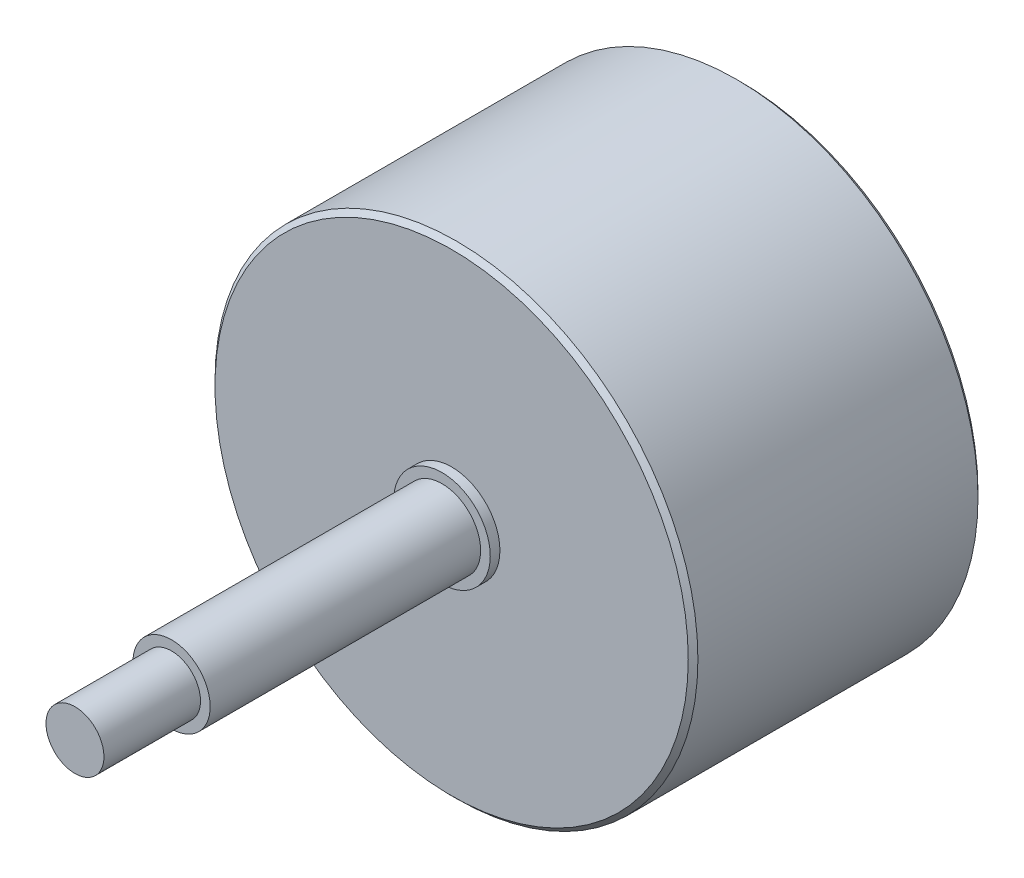
ISO-10303-21;
HEADER;
FILE_DESCRIPTION(('STEP AP214'),'2;1');
FILE_NAME('part.step','',(''),(''),'','','');
FILE_SCHEMA(('AUTOMOTIVE_DESIGN { 1 0 10303 214 1 1 1 1 }'));
ENDSEC;
DATA;
#1=APPLICATION_CONTEXT('core data for automotive mechanical design processes');
#2=APPLICATION_PROTOCOL_DEFINITION('international standard','automotive_design',2000,#1);
#3=PRODUCT_CONTEXT('',#1,'mechanical');
#4=PRODUCT('Part','Part','',(#3));
#5=PRODUCT_RELATED_PRODUCT_CATEGORY('part','',(#4));
#6=PRODUCT_DEFINITION_FORMATION('','',#4);
#7=PRODUCT_DEFINITION_CONTEXT('part definition',#1,'design');
#8=PRODUCT_DEFINITION('design','',#6,#7);
#9=PRODUCT_DEFINITION_SHAPE('','',#8);
#10=(LENGTH_UNIT() NAMED_UNIT(*) SI_UNIT(.MILLI.,.METRE.));
#11=(NAMED_UNIT(*) PLANE_ANGLE_UNIT() SI_UNIT($,.RADIAN.));
#12=(NAMED_UNIT(*) SI_UNIT($,.STERADIAN.) SOLID_ANGLE_UNIT());
#13=UNCERTAINTY_MEASURE_WITH_UNIT(LENGTH_MEASURE(1.E-05),#10,'distance_accuracy_value','');
#14=(GEOMETRIC_REPRESENTATION_CONTEXT(3) GLOBAL_UNCERTAINTY_ASSIGNED_CONTEXT((#13)) GLOBAL_UNIT_ASSIGNED_CONTEXT((#10,
#11,#12)) REPRESENTATION_CONTEXT('',''));
#15=CARTESIAN_POINT('',(0.,0.,0.));
#16=DIRECTION('',(0.,0.,1.));
#17=DIRECTION('',(1.,0.,0.));
#18=AXIS2_PLACEMENT_3D('',#15,#16,#17);
#19=CARTESIAN_POINT('',(0.,0.,69.));
#20=DIRECTION('',(0.,0.,-1.));
#21=DIRECTION('',(-1.,0.,0.));
#22=AXIS2_PLACEMENT_3D('',#19,#20,#21);
#23=CYLINDRICAL_SURFACE('',#22,4.);
#24=CARTESIAN_POINT('',(0.,0.,31.));
#25=DIRECTION('',(0.,0.,1.));
#26=DIRECTION('',(1.,0.,0.));
#27=AXIS2_PLACEMENT_3D('',#24,#25,#26);
#28=CIRCLE('',#27,4.);
#29=CARTESIAN_POINT('',(4.,0.,31.));
#30=VERTEX_POINT('',#29);
#31=EDGE_CURVE('E59',#30,#30,#28,.T.);
#32=ORIENTED_EDGE('',*,*,#31,.T.);
#33=EDGE_LOOP('',(#32));
#34=FACE_BOUND('',#33,.T.);
#35=CARTESIAN_POINT('',(0.,0.,59.));
#36=DIRECTION('',(0.,0.,1.));
#37=DIRECTION('',(0.,-1.,0.));
#38=AXIS2_PLACEMENT_3D('',#35,#36,#37);
#39=CIRCLE('',#38,4.);
#40=CARTESIAN_POINT('',(0.,-4.,59.));
#41=VERTEX_POINT('',#40);
#42=EDGE_CURVE('E80',#41,#41,#39,.T.);
#43=ORIENTED_EDGE('',*,*,#42,.F.);
#44=EDGE_LOOP('',(#43));
#45=FACE_BOUND('',#44,.T.);
#46=ADVANCED_FACE('F38',(#34,#45),#23,.T.);
#47=CARTESIAN_POINT('',(0.,0.,30.));
#48=DIRECTION('',(0.,0.,-1.));
#49=DIRECTION('',(-1.,0.,0.));
#50=AXIS2_PLACEMENT_3D('',#47,#48,#49);
#51=CYLINDRICAL_SURFACE('',#50,25.);
#52=CARTESIAN_POINT('',(0.,0.,0.500000000000011));
#53=DIRECTION('',(0.,0.,1.));
#54=DIRECTION('',(1.,0.,0.));
#55=AXIS2_PLACEMENT_3D('',#52,#53,#54);
#56=CIRCLE('',#55,25.);
#57=CARTESIAN_POINT('',(25.,0.,0.500000000000011));
#58=VERTEX_POINT('',#57);
#59=EDGE_CURVE('E50',#58,#58,#56,.T.);
#60=ORIENTED_EDGE('',*,*,#59,.T.);
#61=EDGE_LOOP('',(#60));
#62=FACE_BOUND('',#61,.T.);
#63=CARTESIAN_POINT('',(0.,0.,29.5));
#64=DIRECTION('',(0.,0.,1.));
#65=DIRECTION('',(1.,0.,0.));
#66=AXIS2_PLACEMENT_3D('',#63,#64,#65);
#67=CIRCLE('',#66,25.);
#68=CARTESIAN_POINT('',(25.,0.,29.5));
#69=VERTEX_POINT('',#68);
#70=EDGE_CURVE('E54',#69,#69,#67,.F.);
#71=ORIENTED_EDGE('',*,*,#70,.T.);
#72=EDGE_LOOP('',(#71));
#73=FACE_BOUND('',#72,.T.);
#74=ADVANCED_FACE('F88',(#62,#73),#51,.T.);
#75=CARTESIAN_POINT('',(0.,0.,30.));
#76=DIRECTION('',(0.,0.,1.));
#77=DIRECTION('',(1.,0.,0.));
#78=AXIS2_PLACEMENT_3D('',#75,#76,#77);
#79=PLANE('',#78);
#80=CARTESIAN_POINT('',(0.,0.,30.));
#81=DIRECTION('',(0.,0.,1.));
#82=DIRECTION('',(1.,0.,0.));
#83=AXIS2_PLACEMENT_3D('',#80,#81,#82);
#84=CIRCLE('',#83,24.5);
#85=CARTESIAN_POINT('',(24.5,0.,30.));
#86=VERTEX_POINT('',#85);
#87=EDGE_CURVE('E10',#86,#86,#84,.T.);
#88=ORIENTED_EDGE('',*,*,#87,.T.);
#89=EDGE_LOOP('',(#88));
#90=FACE_BOUND('',#89,.T.);
#91=CARTESIAN_POINT('',(0.,0.,30.));
#92=DIRECTION('',(0.,0.,1.));
#93=DIRECTION('',(1.,0.,0.));
#94=AXIS2_PLACEMENT_3D('',#91,#92,#93);
#95=CIRCLE('',#94,5.);
#96=CARTESIAN_POINT('',(5.,0.,30.));
#97=VERTEX_POINT('',#96);
#98=EDGE_CURVE('E63',#97,#97,#95,.T.);
#99=ORIENTED_EDGE('',*,*,#98,.F.);
#100=EDGE_LOOP('',(#99));
#101=FACE_BOUND('',#100,.T.);
#102=ADVANCED_FACE('F94',(#90,#101),#79,.T.);
#103=CARTESIAN_POINT('',(0.,0.,0.));
#104=DIRECTION('',(0.,0.,1.));
#105=DIRECTION('',(1.,0.,0.));
#106=AXIS2_PLACEMENT_3D('',#103,#104,#105);
#107=PLANE('',#106);
#108=CARTESIAN_POINT('',(0.,0.,0.));
#109=DIRECTION('',(0.,0.,1.));
#110=DIRECTION('',(1.,0.,0.));
#111=AXIS2_PLACEMENT_3D('',#108,#109,#110);
#112=CIRCLE('',#111,24.5);
#113=CARTESIAN_POINT('',(24.5,0.,0.));
#114=VERTEX_POINT('',#113);
#115=EDGE_CURVE('E46',#114,#114,#112,.F.);
#116=ORIENTED_EDGE('',*,*,#115,.T.);
#117=EDGE_LOOP('',(#116));
#118=FACE_BOUND('',#117,.T.);
#119=CARTESIAN_POINT('',(0.,0.,0.));
#120=DIRECTION('',(0.,0.,-1.));
#121=DIRECTION('',(-1.,0.,0.));
#122=AXIS2_PLACEMENT_3D('',#119,#120,#121);
#123=CIRCLE('',#122,3.);
#124=CARTESIAN_POINT('',(-3.,0.,0.));
#125=VERTEX_POINT('',#124);
#126=EDGE_CURVE('E69',#125,#125,#123,.T.);
#127=ORIENTED_EDGE('',*,*,#126,.F.);
#128=EDGE_LOOP('',(#127));
#129=FACE_BOUND('',#128,.T.);
#130=ADVANCED_FACE('F108',(#118,#129),#107,.F.);
#131=CARTESIAN_POINT('',(0.,0.,31.));
#132=DIRECTION('',(0.,0.,-1.));
#133=DIRECTION('',(-1.,0.,0.));
#134=AXIS2_PLACEMENT_3D('',#131,#132,#133);
#135=CYLINDRICAL_SURFACE('',#134,5.);
#136=CARTESIAN_POINT('',(0.,0.,31.));
#137=DIRECTION('',(0.,0.,1.));
#138=DIRECTION('',(1.,0.,0.));
#139=AXIS2_PLACEMENT_3D('',#136,#137,#138);
#140=CIRCLE('',#139,5.);
#141=CARTESIAN_POINT('',(5.,0.,31.));
#142=VERTEX_POINT('',#141);
#143=EDGE_CURVE('E62',#142,#142,#140,.T.);
#144=ORIENTED_EDGE('',*,*,#143,.F.);
#145=EDGE_LOOP('',(#144));
#146=FACE_BOUND('',#145,.T.);
#147=ORIENTED_EDGE('',*,*,#98,.T.);
#148=EDGE_LOOP('',(#147));
#149=FACE_BOUND('',#148,.T.);
#150=ADVANCED_FACE('F111',(#146,#149),#135,.T.);
#151=CARTESIAN_POINT('',(0.,0.,31.));
#152=DIRECTION('',(0.,0.,1.));
#153=DIRECTION('',(1.,0.,0.));
#154=AXIS2_PLACEMENT_3D('',#151,#152,#153);
#155=PLANE('',#154);
#156=ORIENTED_EDGE('',*,*,#31,.F.);
#157=EDGE_LOOP('',(#156));
#158=FACE_BOUND('',#157,.T.);
#159=ORIENTED_EDGE('',*,*,#143,.T.);
#160=EDGE_LOOP('',(#159));
#161=FACE_BOUND('',#160,.T.);
#162=ADVANCED_FACE('F134',(#158,#161),#155,.T.);
#163=CARTESIAN_POINT('',(0.,0.,10.));
#164=DIRECTION('',(0.,0.,-1.));
#165=DIRECTION('',(-1.,0.,0.));
#166=AXIS2_PLACEMENT_3D('',#163,#164,#165);
#167=CYLINDRICAL_SURFACE('',#166,3.);
#168=CARTESIAN_POINT('',(0.,0.,10.));
#169=DIRECTION('',(0.,0.,-1.));
#170=DIRECTION('',(-1.,0.,0.));
#171=AXIS2_PLACEMENT_3D('',#168,#169,#170);
#172=CIRCLE('',#171,3.);
#173=CARTESIAN_POINT('',(-3.,0.,10.));
#174=VERTEX_POINT('',#173);
#175=EDGE_CURVE('E66',#174,#174,#172,.T.);
#176=ORIENTED_EDGE('',*,*,#175,.F.);
#177=EDGE_LOOP('',(#176));
#178=FACE_BOUND('',#177,.T.);
#179=ORIENTED_EDGE('',*,*,#126,.T.);
#180=EDGE_LOOP('',(#179));
#181=FACE_BOUND('',#180,.T.);
#182=ADVANCED_FACE('F123',(#178,#181),#167,.F.);
#183=CARTESIAN_POINT('',(0.,0.,10.));
#184=DIRECTION('',(0.,0.,-1.));
#185=DIRECTION('',(-1.,0.,0.));
#186=AXIS2_PLACEMENT_3D('',#183,#184,#185);
#187=PLANE('',#186);
#188=ORIENTED_EDGE('',*,*,#175,.T.);
#189=EDGE_LOOP('',(#188));
#190=FACE_BOUND('',#189,.T.);
#191=ADVANCED_FACE('F116',(#190),#187,.T.);
#192=CARTESIAN_POINT('',(0.,0.,0.500000000000011));
#193=DIRECTION('',(0.,0.,1.));
#194=DIRECTION('',(1.,0.,0.));
#195=AXIS2_PLACEMENT_3D('',#192,#193,#194);
#196=CONICAL_SURFACE('',#195,25.,0.785398163397459);
#197=ORIENTED_EDGE('',*,*,#115,.F.);
#198=EDGE_LOOP('',(#197));
#199=FACE_BOUND('',#198,.T.);
#200=ORIENTED_EDGE('',*,*,#59,.F.);
#201=EDGE_LOOP('',(#200));
#202=FACE_BOUND('',#201,.T.);
#203=ADVANCED_FACE('F113',(#199,#202),#196,.T.);
#204=CARTESIAN_POINT('',(0.,0.,30.));
#205=DIRECTION('',(0.,0.,-1.));
#206=DIRECTION('',(-1.,0.,0.));
#207=AXIS2_PLACEMENT_3D('',#204,#205,#206);
#208=CONICAL_SURFACE('',#207,24.5,0.785398163397438);
#209=ORIENTED_EDGE('',*,*,#70,.F.);
#210=EDGE_LOOP('',(#209));
#211=FACE_BOUND('',#210,.T.);
#212=ORIENTED_EDGE('',*,*,#87,.F.);
#213=EDGE_LOOP('',(#212));
#214=FACE_BOUND('',#213,.T.);
#215=ADVANCED_FACE('F41',(#211,#214),#208,.T.);
#216=CARTESIAN_POINT('',(0.,4.,59.));
#217=DIRECTION('',(0.,0.,1.));
#218=DIRECTION('',(0.,-1.,0.));
#219=AXIS2_PLACEMENT_3D('',#216,#217,#218);
#220=PLANE('',#219);
#221=ORIENTED_EDGE('',*,*,#42,.T.);
#222=EDGE_LOOP('',(#221));
#223=FACE_BOUND('',#222,.T.);
#224=CARTESIAN_POINT('',(0.,0.,59.));
#225=DIRECTION('',(0.,0.,1.));
#226=DIRECTION('',(0.,-1.,0.));
#227=AXIS2_PLACEMENT_3D('',#224,#225,#226);
#228=CIRCLE('',#227,3.);
#229=CARTESIAN_POINT('',(0.,-3.,59.));
#230=VERTEX_POINT('',#229);
#231=EDGE_CURVE('E72',#230,#230,#228,.T.);
#232=ORIENTED_EDGE('',*,*,#231,.F.);
#233=EDGE_LOOP('',(#232));
#234=FACE_BOUND('',#233,.T.);
#235=ADVANCED_FACE('F84',(#223,#234),#220,.T.);
#236=CARTESIAN_POINT('',(0.,0.,69.));
#237=DIRECTION('',(0.,0.,1.));
#238=DIRECTION('',(0.,-1.,0.));
#239=AXIS2_PLACEMENT_3D('',#236,#237,#238);
#240=CYLINDRICAL_SURFACE('',#239,3.);
#241=ORIENTED_EDGE('',*,*,#231,.T.);
#242=EDGE_LOOP('',(#241));
#243=FACE_BOUND('',#242,.T.);
#244=CARTESIAN_POINT('',(0.,0.,69.));
#245=DIRECTION('',(0.,0.,1.));
#246=DIRECTION('',(0.,-1.,0.));
#247=AXIS2_PLACEMENT_3D('',#244,#245,#246);
#248=CIRCLE('',#247,3.);
#249=CARTESIAN_POINT('',(0.,-3.,69.));
#250=VERTEX_POINT('',#249);
#251=EDGE_CURVE('E77',#250,#250,#248,.T.);
#252=ORIENTED_EDGE('',*,*,#251,.F.);
#253=EDGE_LOOP('',(#252));
#254=FACE_BOUND('',#253,.T.);
#255=ADVANCED_FACE('F183',(#243,#254),#240,.T.);
#256=CARTESIAN_POINT('',(0.,0.,69.));
#257=DIRECTION('',(0.,0.,1.));
#258=DIRECTION('',(1.,0.,0.));
#259=AXIS2_PLACEMENT_3D('',#256,#257,#258);
#260=PLANE('',#259);
#261=ORIENTED_EDGE('',*,*,#251,.T.);
#262=EDGE_LOOP('',(#261));
#263=FACE_BOUND('',#262,.T.);
#264=ADVANCED_FACE('F102',(#263),#260,.T.);
#265=CLOSED_SHELL('',(#46,#74,#102,#130,#150,#162,#182,#191,#203,#215,#235,#255,#264));
#266=MANIFOLD_SOLID_BREP('B2',#265);
#267=ADVANCED_BREP_SHAPE_REPRESENTATION('',(#18,#266),#14);
#268=SHAPE_DEFINITION_REPRESENTATION(#9,#267);
ENDSEC;
END-ISO-10303-21;
